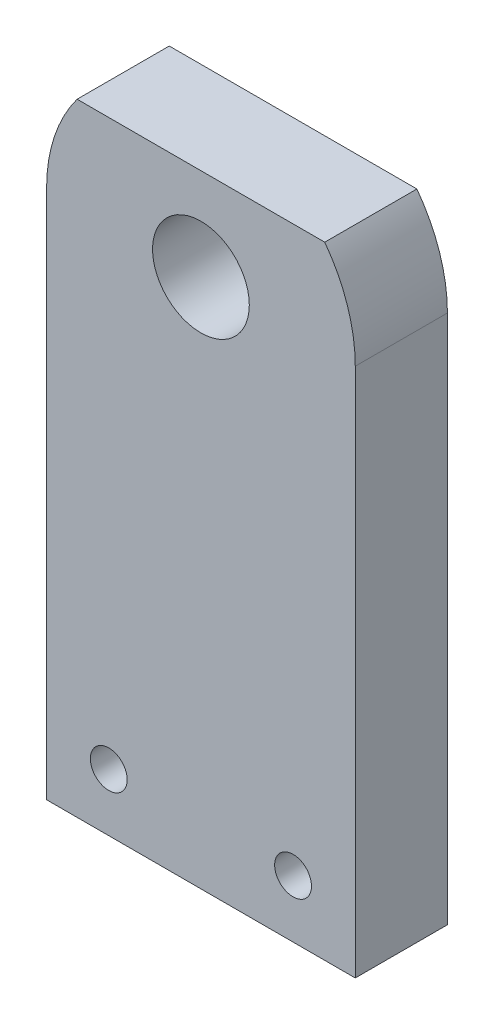
ISO-10303-21;
HEADER;
FILE_DESCRIPTION(('STEP AP214'),'2;1');
FILE_NAME('part.step','',(''),(''),'','','');
FILE_SCHEMA(('AUTOMOTIVE_DESIGN { 1 0 10303 214 1 1 1 1 }'));
ENDSEC;
DATA;
#1=APPLICATION_CONTEXT('core data for automotive mechanical design processes');
#2=APPLICATION_PROTOCOL_DEFINITION('international standard','automotive_design',2000,#1);
#3=PRODUCT_CONTEXT('',#1,'mechanical');
#4=PRODUCT('Part','Part','',(#3));
#5=PRODUCT_RELATED_PRODUCT_CATEGORY('part','',(#4));
#6=PRODUCT_DEFINITION_FORMATION('','',#4);
#7=PRODUCT_DEFINITION_CONTEXT('part definition',#1,'design');
#8=PRODUCT_DEFINITION('design','',#6,#7);
#9=PRODUCT_DEFINITION_SHAPE('','',#8);
#10=(LENGTH_UNIT() NAMED_UNIT(*) SI_UNIT(.MILLI.,.METRE.));
#11=(NAMED_UNIT(*) PLANE_ANGLE_UNIT() SI_UNIT($,.RADIAN.));
#12=(NAMED_UNIT(*) SI_UNIT($,.STERADIAN.) SOLID_ANGLE_UNIT());
#13=UNCERTAINTY_MEASURE_WITH_UNIT(LENGTH_MEASURE(1.E-05),#10,'distance_accuracy_value','');
#14=(GEOMETRIC_REPRESENTATION_CONTEXT(3) GLOBAL_UNCERTAINTY_ASSIGNED_CONTEXT((#13)) GLOBAL_UNIT_ASSIGNED_CONTEXT((#10,
#11,#12)) REPRESENTATION_CONTEXT('',''));
#15=CARTESIAN_POINT('',(0.,0.,0.));
#16=DIRECTION('',(0.,0.,1.));
#17=DIRECTION('',(1.,0.,0.));
#18=AXIS2_PLACEMENT_3D('',#15,#16,#17);
#19=CARTESIAN_POINT('',(0.,0.,4.));
#20=DIRECTION('',(0.,0.,-1.));
#21=DIRECTION('',(-1.,0.,0.));
#22=AXIS2_PLACEMENT_3D('',#19,#20,#21);
#23=CYLINDRICAL_SURFACE('',#22,6.7);
#24=CARTESIAN_POINT('',(0.,0.,0.));
#25=DIRECTION('',(0.,0.,1.));
#26=DIRECTION('',(1.,0.,0.));
#27=AXIS2_PLACEMENT_3D('',#24,#25,#26);
#28=CIRCLE('',#27,6.7);
#29=CARTESIAN_POINT('',(-5.37494186015068,4.,0.));
#30=VERTEX_POINT('',#29);
#31=CARTESIAN_POINT('',(-6.7,0.,0.));
#32=VERTEX_POINT('',#31);
#33=EDGE_CURVE('E125',#30,#32,#28,.T.);
#34=ORIENTED_EDGE('',*,*,#33,.T.);
#35=DIRECTION('',(0.,0.,-1.));
#36=VECTOR('',#35,1.);
#37=CARTESIAN_POINT('',(-6.7,0.,4.));
#38=LINE('',#37,#36);
#39=CARTESIAN_POINT('',(-6.7,0.,4.));
#40=VERTEX_POINT('',#39);
#41=EDGE_CURVE('E11',#40,#32,#38,.T.);
#42=ORIENTED_EDGE('',*,*,#41,.F.);
#43=CARTESIAN_POINT('',(0.,0.,4.));
#44=DIRECTION('',(0.,0.,1.));
#45=DIRECTION('',(1.,0.,0.));
#46=AXIS2_PLACEMENT_3D('',#43,#44,#45);
#47=CIRCLE('',#46,6.7);
#48=CARTESIAN_POINT('',(-5.37494186015068,4.,4.));
#49=VERTEX_POINT('',#48);
#50=EDGE_CURVE('E136',#49,#40,#47,.T.);
#51=ORIENTED_EDGE('',*,*,#50,.F.);
#52=DIRECTION('',(0.,0.,-1.));
#53=VECTOR('',#52,1.);
#54=CARTESIAN_POINT('',(-5.37494186015068,4.,4.));
#55=LINE('',#54,#53);
#56=EDGE_CURVE('E121',#49,#30,#55,.T.);
#57=ORIENTED_EDGE('',*,*,#56,.T.);
#58=EDGE_LOOP('',(#34,#42,#51,#57));
#59=FACE_BOUND('',#58,.T.);
#60=ADVANCED_FACE('F41',(#59),#23,.T.);
#61=CARTESIAN_POINT('',(-6.7,0.,4.));
#62=DIRECTION('',(1.,0.,0.));
#63=DIRECTION('',(0.,0.,-1.));
#64=AXIS2_PLACEMENT_3D('',#61,#62,#63);
#65=PLANE('',#64);
#66=DIRECTION('',(0.,-1.,0.));
#67=VECTOR('',#66,1.);
#68=CARTESIAN_POINT('',(-6.7,0.,0.));
#69=LINE('',#68,#67);
#70=CARTESIAN_POINT('',(-6.7,-23.,0.));
#71=VERTEX_POINT('',#70);
#72=EDGE_CURVE('E128',#32,#71,#69,.T.);
#73=ORIENTED_EDGE('',*,*,#72,.T.);
#74=DIRECTION('',(0.,0.,-1.));
#75=VECTOR('',#74,1.);
#76=CARTESIAN_POINT('',(-6.7,-23.,4.));
#77=LINE('',#76,#75);
#78=CARTESIAN_POINT('',(-6.7,-23.,4.));
#79=VERTEX_POINT('',#78);
#80=EDGE_CURVE('E49',#79,#71,#77,.T.);
#81=ORIENTED_EDGE('',*,*,#80,.F.);
#82=DIRECTION('',(0.,-1.,0.));
#83=VECTOR('',#82,1.);
#84=CARTESIAN_POINT('',(-6.7,0.,4.));
#85=LINE('',#84,#83);
#86=EDGE_CURVE('E94',#40,#79,#85,.T.);
#87=ORIENTED_EDGE('',*,*,#86,.F.);
#88=ORIENTED_EDGE('',*,*,#41,.T.);
#89=EDGE_LOOP('',(#73,#81,#87,#88));
#90=FACE_BOUND('',#89,.T.);
#91=ADVANCED_FACE('F161',(#90),#65,.F.);
#92=CARTESIAN_POINT('',(6.7,-23.,4.));
#93=DIRECTION('',(0.,1.,0.));
#94=DIRECTION('',(0.,0.,1.));
#95=AXIS2_PLACEMENT_3D('',#92,#93,#94);
#96=PLANE('',#95);
#97=DIRECTION('',(1.,0.,0.));
#98=VECTOR('',#97,1.);
#99=CARTESIAN_POINT('',(6.7,-23.,0.));
#100=LINE('',#99,#98);
#101=CARTESIAN_POINT('',(6.7,-23.,0.));
#102=VERTEX_POINT('',#101);
#103=EDGE_CURVE('E131',#71,#102,#100,.T.);
#104=ORIENTED_EDGE('',*,*,#103,.T.);
#105=DIRECTION('',(0.,0.,-1.));
#106=VECTOR('',#105,1.);
#107=CARTESIAN_POINT('',(6.7,-23.,4.));
#108=LINE('',#107,#106);
#109=CARTESIAN_POINT('',(6.7,-23.,4.));
#110=VERTEX_POINT('',#109);
#111=EDGE_CURVE('E116',#110,#102,#108,.T.);
#112=ORIENTED_EDGE('',*,*,#111,.F.);
#113=DIRECTION('',(1.,0.,0.));
#114=VECTOR('',#113,1.);
#115=CARTESIAN_POINT('',(6.7,-23.,4.));
#116=LINE('',#115,#114);
#117=EDGE_CURVE('E107',#79,#110,#116,.T.);
#118=ORIENTED_EDGE('',*,*,#117,.F.);
#119=ORIENTED_EDGE('',*,*,#80,.T.);
#120=EDGE_LOOP('',(#104,#112,#118,#119));
#121=FACE_BOUND('',#120,.T.);
#122=ADVANCED_FACE('F142',(#121),#96,.F.);
#123=CARTESIAN_POINT('',(6.7,0.,4.));
#124=DIRECTION('',(-1.,0.,0.));
#125=DIRECTION('',(0.,0.,1.));
#126=AXIS2_PLACEMENT_3D('',#123,#124,#125);
#127=PLANE('',#126);
#128=DIRECTION('',(0.,1.,0.));
#129=VECTOR('',#128,1.);
#130=CARTESIAN_POINT('',(6.7,0.,0.));
#131=LINE('',#130,#129);
#132=CARTESIAN_POINT('',(6.7,0.,0.));
#133=VERTEX_POINT('',#132);
#134=EDGE_CURVE('E115',#102,#133,#131,.T.);
#135=ORIENTED_EDGE('',*,*,#134,.T.);
#136=DIRECTION('',(0.,0.,-1.));
#137=VECTOR('',#136,1.);
#138=CARTESIAN_POINT('',(6.7,0.,4.));
#139=LINE('',#138,#137);
#140=CARTESIAN_POINT('',(6.7,0.,4.));
#141=VERTEX_POINT('',#140);
#142=EDGE_CURVE('E112',#141,#133,#139,.T.);
#143=ORIENTED_EDGE('',*,*,#142,.F.);
#144=DIRECTION('',(0.,1.,0.));
#145=VECTOR('',#144,1.);
#146=CARTESIAN_POINT('',(6.7,0.,4.));
#147=LINE('',#146,#145);
#148=EDGE_CURVE('E101',#110,#141,#147,.T.);
#149=ORIENTED_EDGE('',*,*,#148,.F.);
#150=ORIENTED_EDGE('',*,*,#111,.T.);
#151=EDGE_LOOP('',(#135,#143,#149,#150));
#152=FACE_BOUND('',#151,.T.);
#153=ADVANCED_FACE('F113',(#152),#127,.F.);
#154=CARTESIAN_POINT('',(0.,0.,4.));
#155=DIRECTION('',(0.,0.,-1.));
#156=DIRECTION('',(-1.,0.,0.));
#157=AXIS2_PLACEMENT_3D('',#154,#155,#156);
#158=CYLINDRICAL_SURFACE('',#157,6.7);
#159=CARTESIAN_POINT('',(0.,0.,0.));
#160=DIRECTION('',(0.,0.,1.));
#161=DIRECTION('',(1.,0.,0.));
#162=AXIS2_PLACEMENT_3D('',#159,#160,#161);
#163=CIRCLE('',#162,6.7);
#164=CARTESIAN_POINT('',(5.37494186015068,4.,0.));
#165=VERTEX_POINT('',#164);
#166=EDGE_CURVE('E80',#133,#165,#163,.T.);
#167=ORIENTED_EDGE('',*,*,#166,.T.);
#168=DIRECTION('',(0.,0.,-1.));
#169=VECTOR('',#168,1.);
#170=CARTESIAN_POINT('',(5.37494186015068,4.,4.));
#171=LINE('',#170,#169);
#172=CARTESIAN_POINT('',(5.37494186015068,4.,4.));
#173=VERTEX_POINT('',#172);
#174=EDGE_CURVE('E117',#173,#165,#171,.T.);
#175=ORIENTED_EDGE('',*,*,#174,.F.);
#176=CARTESIAN_POINT('',(0.,0.,4.));
#177=DIRECTION('',(0.,0.,1.));
#178=DIRECTION('',(1.,0.,0.));
#179=AXIS2_PLACEMENT_3D('',#176,#177,#178);
#180=CIRCLE('',#179,6.7);
#181=EDGE_CURVE('E105',#141,#173,#180,.T.);
#182=ORIENTED_EDGE('',*,*,#181,.F.);
#183=ORIENTED_EDGE('',*,*,#142,.T.);
#184=EDGE_LOOP('',(#167,#175,#182,#183));
#185=FACE_BOUND('',#184,.T.);
#186=ADVANCED_FACE('F119',(#185),#158,.T.);
#187=CARTESIAN_POINT('',(-5.37494186015068,4.,4.));
#188=DIRECTION('',(0.,-1.,0.));
#189=DIRECTION('',(0.,0.,-1.));
#190=AXIS2_PLACEMENT_3D('',#187,#188,#189);
#191=PLANE('',#190);
#192=DIRECTION('',(-1.,0.,0.));
#193=VECTOR('',#192,1.);
#194=CARTESIAN_POINT('',(-5.37494186015068,4.,0.));
#195=LINE('',#194,#193);
#196=EDGE_CURVE('E86',#165,#30,#195,.T.);
#197=ORIENTED_EDGE('',*,*,#196,.T.);
#198=ORIENTED_EDGE('',*,*,#56,.F.);
#199=DIRECTION('',(-1.,0.,0.));
#200=VECTOR('',#199,1.);
#201=CARTESIAN_POINT('',(-5.37494186015068,4.,4.));
#202=LINE('',#201,#200);
#203=EDGE_CURVE('E57',#173,#49,#202,.T.);
#204=ORIENTED_EDGE('',*,*,#203,.F.);
#205=ORIENTED_EDGE('',*,*,#174,.T.);
#206=EDGE_LOOP('',(#197,#198,#204,#205));
#207=FACE_BOUND('',#206,.T.);
#208=ADVANCED_FACE('F149',(#207),#191,.F.);
#209=CARTESIAN_POINT('',(0.,0.,4.));
#210=DIRECTION('',(0.,0.,1.));
#211=DIRECTION('',(1.,0.,0.));
#212=AXIS2_PLACEMENT_3D('',#209,#210,#211);
#213=PLANE('',#212);
#214=CARTESIAN_POINT('',(0.,0.,4.));
#215=DIRECTION('',(0.,0.,1.));
#216=DIRECTION('',(1.,0.,0.));
#217=AXIS2_PLACEMENT_3D('',#214,#215,#216);
#218=CIRCLE('',#217,2.1);
#219=CARTESIAN_POINT('',(2.1,0.,4.));
#220=VERTEX_POINT('',#219);
#221=EDGE_CURVE('E295',#220,#220,#218,.T.);
#222=ORIENTED_EDGE('',*,*,#221,.F.);
#223=EDGE_LOOP('',(#222));
#224=FACE_BOUND('',#223,.T.);
#225=CARTESIAN_POINT('',(-4.,-20.5,4.));
#226=DIRECTION('',(0.,0.,1.));
#227=DIRECTION('',(1.,0.,0.));
#228=AXIS2_PLACEMENT_3D('',#225,#226,#227);
#229=CIRCLE('',#228,0.799999999999999);
#230=CARTESIAN_POINT('',(-3.2,-20.5,4.));
#231=VERTEX_POINT('',#230);
#232=EDGE_CURVE('E297',#231,#231,#229,.T.);
#233=ORIENTED_EDGE('',*,*,#232,.F.);
#234=EDGE_LOOP('',(#233));
#235=FACE_BOUND('',#234,.T.);
#236=CARTESIAN_POINT('',(4.,-20.5,4.));
#237=DIRECTION('',(0.,0.,1.));
#238=DIRECTION('',(1.,0.,0.));
#239=AXIS2_PLACEMENT_3D('',#236,#237,#238);
#240=CIRCLE('',#239,0.799999999999999);
#241=CARTESIAN_POINT('',(4.8,-20.5,4.));
#242=VERTEX_POINT('',#241);
#243=EDGE_CURVE('E305',#242,#242,#240,.T.);
#244=ORIENTED_EDGE('',*,*,#243,.F.);
#245=EDGE_LOOP('',(#244));
#246=FACE_BOUND('',#245,.T.);
#247=ORIENTED_EDGE('',*,*,#50,.T.);
#248=ORIENTED_EDGE('',*,*,#86,.T.);
#249=ORIENTED_EDGE('',*,*,#117,.T.);
#250=ORIENTED_EDGE('',*,*,#148,.T.);
#251=ORIENTED_EDGE('',*,*,#181,.T.);
#252=ORIENTED_EDGE('',*,*,#203,.T.);
#253=EDGE_LOOP('',(#247,#248,#249,#250,#251,#252));
#254=FACE_BOUND('',#253,.T.);
#255=ADVANCED_FACE('F103',(#224,#235,#246,#254),#213,.T.);
#256=CARTESIAN_POINT('',(0.,0.,0.));
#257=DIRECTION('',(0.,0.,1.));
#258=DIRECTION('',(1.,0.,0.));
#259=AXIS2_PLACEMENT_3D('',#256,#257,#258);
#260=PLANE('',#259);
#261=CARTESIAN_POINT('',(0.,0.,0.));
#262=DIRECTION('',(0.,0.,1.));
#263=DIRECTION('',(1.,0.,0.));
#264=AXIS2_PLACEMENT_3D('',#261,#262,#263);
#265=CIRCLE('',#264,2.1);
#266=CARTESIAN_POINT('',(2.1,0.,0.));
#267=VERTEX_POINT('',#266);
#268=EDGE_CURVE('E292',#267,#267,#265,.T.);
#269=ORIENTED_EDGE('',*,*,#268,.T.);
#270=EDGE_LOOP('',(#269));
#271=FACE_BOUND('',#270,.T.);
#272=CARTESIAN_POINT('',(-4.,-20.5,0.));
#273=DIRECTION('',(0.,0.,1.));
#274=DIRECTION('',(1.,0.,0.));
#275=AXIS2_PLACEMENT_3D('',#272,#273,#274);
#276=CIRCLE('',#275,0.799999999999999);
#277=CARTESIAN_POINT('',(-3.2,-20.5,0.));
#278=VERTEX_POINT('',#277);
#279=EDGE_CURVE('E302',#278,#278,#276,.T.);
#280=ORIENTED_EDGE('',*,*,#279,.T.);
#281=EDGE_LOOP('',(#280));
#282=FACE_BOUND('',#281,.T.);
#283=CARTESIAN_POINT('',(4.,-20.5,0.));
#284=DIRECTION('',(0.,0.,1.));
#285=DIRECTION('',(1.,0.,0.));
#286=AXIS2_PLACEMENT_3D('',#283,#284,#285);
#287=CIRCLE('',#286,0.799999999999999);
#288=CARTESIAN_POINT('',(4.8,-20.5,0.));
#289=VERTEX_POINT('',#288);
#290=EDGE_CURVE('E129',#289,#289,#287,.T.);
#291=ORIENTED_EDGE('',*,*,#290,.T.);
#292=EDGE_LOOP('',(#291));
#293=FACE_BOUND('',#292,.T.);
#294=ORIENTED_EDGE('',*,*,#33,.F.);
#295=ORIENTED_EDGE('',*,*,#196,.F.);
#296=ORIENTED_EDGE('',*,*,#166,.F.);
#297=ORIENTED_EDGE('',*,*,#134,.F.);
#298=ORIENTED_EDGE('',*,*,#103,.F.);
#299=ORIENTED_EDGE('',*,*,#72,.F.);
#300=EDGE_LOOP('',(#294,#295,#296,#297,#298,#299));
#301=FACE_BOUND('',#300,.T.);
#302=ADVANCED_FACE('F145',(#271,#282,#293,#301),#260,.F.);
#303=CARTESIAN_POINT('',(4.,-20.5,4.));
#304=DIRECTION('',(0.,0.,1.));
#305=DIRECTION('',(1.,0.,0.));
#306=AXIS2_PLACEMENT_3D('',#303,#304,#305);
#307=CYLINDRICAL_SURFACE('',#306,0.799999999999999);
#308=ORIENTED_EDGE('',*,*,#290,.F.);
#309=EDGE_LOOP('',(#308));
#310=FACE_BOUND('',#309,.T.);
#311=ORIENTED_EDGE('',*,*,#243,.T.);
#312=EDGE_LOOP('',(#311));
#313=FACE_BOUND('',#312,.T.);
#314=ADVANCED_FACE('F191',(#310,#313),#307,.F.);
#315=CARTESIAN_POINT('',(-4.,-20.5,4.));
#316=DIRECTION('',(0.,0.,1.));
#317=DIRECTION('',(1.,0.,0.));
#318=AXIS2_PLACEMENT_3D('',#315,#316,#317);
#319=CYLINDRICAL_SURFACE('',#318,0.799999999999999);
#320=ORIENTED_EDGE('',*,*,#279,.F.);
#321=EDGE_LOOP('',(#320));
#322=FACE_BOUND('',#321,.T.);
#323=ORIENTED_EDGE('',*,*,#232,.T.);
#324=EDGE_LOOP('',(#323));
#325=FACE_BOUND('',#324,.T.);
#326=ADVANCED_FACE('F197',(#322,#325),#319,.F.);
#327=CARTESIAN_POINT('',(0.,0.,4.));
#328=DIRECTION('',(0.,0.,1.));
#329=DIRECTION('',(1.,0.,0.));
#330=AXIS2_PLACEMENT_3D('',#327,#328,#329);
#331=CYLINDRICAL_SURFACE('',#330,2.1);
#332=ORIENTED_EDGE('',*,*,#268,.F.);
#333=EDGE_LOOP('',(#332));
#334=FACE_BOUND('',#333,.T.);
#335=ORIENTED_EDGE('',*,*,#221,.T.);
#336=EDGE_LOOP('',(#335));
#337=FACE_BOUND('',#336,.T.);
#338=ADVANCED_FACE('F211',(#334,#337),#331,.F.);
#339=CLOSED_SHELL('',(#60,#91,#122,#153,#186,#208,#255,#302,#314,#326,#338));
#340=MANIFOLD_SOLID_BREP('B2',#339);
#341=ADVANCED_BREP_SHAPE_REPRESENTATION('',(#18,#340),#14);
#342=SHAPE_DEFINITION_REPRESENTATION(#9,#341);
ENDSEC;
END-ISO-10303-21;
